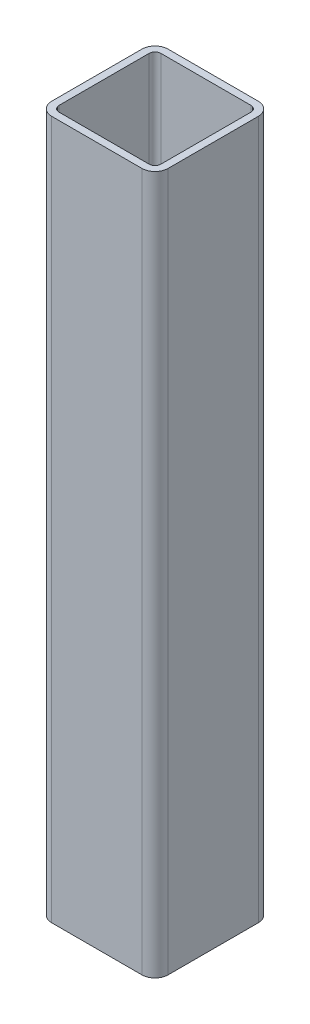
ISO-10303-21;
HEADER;
FILE_DESCRIPTION(('STEP AP214'),'2;1');
FILE_NAME('part.step','',(''),(''),'','','');
FILE_SCHEMA(('AUTOMOTIVE_DESIGN { 1 0 10303 214 1 1 1 1 }'));
ENDSEC;
DATA;
#1=APPLICATION_CONTEXT('core data for automotive mechanical design processes');
#2=APPLICATION_PROTOCOL_DEFINITION('international standard','automotive_design',2000,#1);
#3=PRODUCT_CONTEXT('',#1,'mechanical');
#4=PRODUCT('Part','Part','',(#3));
#5=PRODUCT_RELATED_PRODUCT_CATEGORY('part','',(#4));
#6=PRODUCT_DEFINITION_FORMATION('','',#4);
#7=PRODUCT_DEFINITION_CONTEXT('part definition',#1,'design');
#8=PRODUCT_DEFINITION('design','',#6,#7);
#9=PRODUCT_DEFINITION_SHAPE('','',#8);
#10=(LENGTH_UNIT() NAMED_UNIT(*) SI_UNIT(.MILLI.,.METRE.));
#11=(NAMED_UNIT(*) PLANE_ANGLE_UNIT() SI_UNIT($,.RADIAN.));
#12=(NAMED_UNIT(*) SI_UNIT($,.STERADIAN.) SOLID_ANGLE_UNIT());
#13=UNCERTAINTY_MEASURE_WITH_UNIT(LENGTH_MEASURE(1.E-05),#10,'distance_accuracy_value','');
#14=(GEOMETRIC_REPRESENTATION_CONTEXT(3) GLOBAL_UNCERTAINTY_ASSIGNED_CONTEXT((#13)) GLOBAL_UNIT_ASSIGNED_CONTEXT((#10,
#11,#12)) REPRESENTATION_CONTEXT('',''));
#15=CARTESIAN_POINT('',(0.,0.,0.));
#16=DIRECTION('',(0.,0.,1.));
#17=DIRECTION('',(1.,0.,0.));
#18=AXIS2_PLACEMENT_3D('',#15,#16,#17);
#19=CARTESIAN_POINT('',(-19.685,152.4,-19.685));
#20=DIRECTION('',(0.,-1.,0.));
#21=DIRECTION('',(0.,0.,-1.));
#22=AXIS2_PLACEMENT_3D('',#19,#20,#21);
#23=PLANE('',#22);
#24=CARTESIAN_POINT('',(-19.685,152.4,-19.685));
#25=DIRECTION('',(0.,1.,0.));
#26=DIRECTION('',(0.,0.,-1.));
#27=AXIS2_PLACEMENT_3D('',#24,#25,#26);
#28=CIRCLE('',#27,5.715);
#29=CARTESIAN_POINT('',(-19.685,152.4,-25.4));
#30=VERTEX_POINT('',#29);
#31=CARTESIAN_POINT('',(-25.4,152.4,-19.685));
#32=VERTEX_POINT('',#31);
#33=EDGE_CURVE('E208',#30,#32,#28,.T.);
#34=ORIENTED_EDGE('',*,*,#33,.T.);
#35=DIRECTION('',(0.,0.,1.));
#36=VECTOR('',#35,1.);
#37=CARTESIAN_POINT('',(-25.4,152.4,19.685));
#38=LINE('',#37,#36);
#39=CARTESIAN_POINT('',(-25.4,152.4,19.685));
#40=VERTEX_POINT('',#39);
#41=EDGE_CURVE('E211',#32,#40,#38,.T.);
#42=ORIENTED_EDGE('',*,*,#41,.T.);
#43=CARTESIAN_POINT('',(-19.685,152.4,19.685));
#44=DIRECTION('',(0.,1.,0.));
#45=DIRECTION('',(0.,0.,-1.));
#46=AXIS2_PLACEMENT_3D('',#43,#44,#45);
#47=CIRCLE('',#46,5.715);
#48=CARTESIAN_POINT('',(-19.685,152.4,25.4));
#49=VERTEX_POINT('',#48);
#50=EDGE_CURVE('E214',#40,#49,#47,.T.);
#51=ORIENTED_EDGE('',*,*,#50,.T.);
#52=DIRECTION('',(1.,0.,0.));
#53=VECTOR('',#52,1.);
#54=CARTESIAN_POINT('',(-19.685,152.4,25.4));
#55=LINE('',#54,#53);
#56=CARTESIAN_POINT('',(19.685,152.4,25.4));
#57=VERTEX_POINT('',#56);
#58=EDGE_CURVE('E216',#49,#57,#55,.T.);
#59=ORIENTED_EDGE('',*,*,#58,.T.);
#60=CARTESIAN_POINT('',(19.685,152.4,19.685));
#61=DIRECTION('',(0.,1.,0.));
#62=DIRECTION('',(0.,0.,1.));
#63=AXIS2_PLACEMENT_3D('',#60,#61,#62);
#64=CIRCLE('',#63,5.715);
#65=CARTESIAN_POINT('',(25.4,152.4,19.685));
#66=VERTEX_POINT('',#65);
#67=EDGE_CURVE('E218',#57,#66,#64,.T.);
#68=ORIENTED_EDGE('',*,*,#67,.T.);
#69=DIRECTION('',(0.,0.,-1.));
#70=VECTOR('',#69,1.);
#71=CARTESIAN_POINT('',(25.4,152.4,19.685));
#72=LINE('',#71,#70);
#73=CARTESIAN_POINT('',(25.4,152.4,-19.685));
#74=VERTEX_POINT('',#73);
#75=EDGE_CURVE('E220',#66,#74,#72,.T.);
#76=ORIENTED_EDGE('',*,*,#75,.T.);
#77=CARTESIAN_POINT('',(19.685,152.4,-19.685));
#78=DIRECTION('',(0.,1.,0.));
#79=DIRECTION('',(0.,0.,-1.));
#80=AXIS2_PLACEMENT_3D('',#77,#78,#79);
#81=CIRCLE('',#80,5.715);
#82=CARTESIAN_POINT('',(19.685,152.4,-25.4));
#83=VERTEX_POINT('',#82);
#84=EDGE_CURVE('E222',#74,#83,#81,.T.);
#85=ORIENTED_EDGE('',*,*,#84,.T.);
#86=DIRECTION('',(-1.,0.,0.));
#87=VECTOR('',#86,1.);
#88=CARTESIAN_POINT('',(-19.685,152.4,-25.4));
#89=LINE('',#88,#87);
#90=EDGE_CURVE('E224',#83,#30,#89,.T.);
#91=ORIENTED_EDGE('',*,*,#90,.T.);
#92=EDGE_LOOP('',(#34,#42,#51,#59,#68,#76,#85,#91));
#93=FACE_BOUND('',#92,.T.);
#94=CARTESIAN_POINT('',(-19.685,152.4,19.685));
#95=DIRECTION('',(0.,1.,0.));
#96=DIRECTION('',(0.,0.,-1.));
#97=AXIS2_PLACEMENT_3D('',#94,#95,#96);
#98=CIRCLE('',#97,2.54);
#99=CARTESIAN_POINT('',(-22.225,152.4,19.685));
#100=VERTEX_POINT('',#99);
#101=CARTESIAN_POINT('',(-19.685,152.4,22.225));
#102=VERTEX_POINT('',#101);
#103=EDGE_CURVE('E143',#100,#102,#98,.T.);
#104=ORIENTED_EDGE('',*,*,#103,.F.);
#105=DIRECTION('',(0.,0.,1.));
#106=VECTOR('',#105,1.);
#107=CARTESIAN_POINT('',(-22.225,152.4,19.685));
#108=LINE('',#107,#106);
#109=CARTESIAN_POINT('',(-22.225,152.4,-19.685));
#110=VERTEX_POINT('',#109);
#111=EDGE_CURVE('E176',#110,#100,#108,.T.);
#112=ORIENTED_EDGE('',*,*,#111,.F.);
#113=CARTESIAN_POINT('',(-19.685,152.4,-19.685));
#114=DIRECTION('',(0.,1.,0.));
#115=DIRECTION('',(0.,0.,-1.));
#116=AXIS2_PLACEMENT_3D('',#113,#114,#115);
#117=CIRCLE('',#116,2.54);
#118=CARTESIAN_POINT('',(-19.685,152.4,-22.225));
#119=VERTEX_POINT('',#118);
#120=EDGE_CURVE('E174',#119,#110,#117,.T.);
#121=ORIENTED_EDGE('',*,*,#120,.F.);
#122=DIRECTION('',(-1.,0.,0.));
#123=VECTOR('',#122,1.);
#124=CARTESIAN_POINT('',(-19.685,152.4,-22.225));
#125=LINE('',#124,#123);
#126=CARTESIAN_POINT('',(19.685,152.4,-22.225));
#127=VERTEX_POINT('',#126);
#128=EDGE_CURVE('E172',#127,#119,#125,.T.);
#129=ORIENTED_EDGE('',*,*,#128,.F.);
#130=CARTESIAN_POINT('',(19.685,152.4,-19.685));
#131=DIRECTION('',(0.,1.,0.));
#132=DIRECTION('',(0.,0.,-1.));
#133=AXIS2_PLACEMENT_3D('',#130,#131,#132);
#134=CIRCLE('',#133,2.54);
#135=CARTESIAN_POINT('',(22.225,152.4,-19.685));
#136=VERTEX_POINT('',#135);
#137=EDGE_CURVE('E170',#136,#127,#134,.T.);
#138=ORIENTED_EDGE('',*,*,#137,.F.);
#139=DIRECTION('',(0.,0.,-1.));
#140=VECTOR('',#139,1.);
#141=CARTESIAN_POINT('',(22.225,152.4,19.685));
#142=LINE('',#141,#140);
#143=CARTESIAN_POINT('',(22.225,152.4,19.685));
#144=VERTEX_POINT('',#143);
#145=EDGE_CURVE('E166',#144,#136,#142,.T.);
#146=ORIENTED_EDGE('',*,*,#145,.F.);
#147=CARTESIAN_POINT('',(19.685,152.4,19.685));
#148=DIRECTION('',(0.,1.,0.));
#149=DIRECTION('',(0.,0.,1.));
#150=AXIS2_PLACEMENT_3D('',#147,#148,#149);
#151=CIRCLE('',#150,2.54);
#152=CARTESIAN_POINT('',(19.685,152.4,22.225));
#153=VERTEX_POINT('',#152);
#154=EDGE_CURVE('E164',#153,#144,#151,.T.);
#155=ORIENTED_EDGE('',*,*,#154,.F.);
#156=DIRECTION('',(1.,0.,0.));
#157=VECTOR('',#156,1.);
#158=CARTESIAN_POINT('',(-19.685,152.4,22.225));
#159=LINE('',#158,#157);
#160=EDGE_CURVE('E151',#102,#153,#159,.T.);
#161=ORIENTED_EDGE('',*,*,#160,.F.);
#162=EDGE_LOOP('',(#104,#112,#121,#129,#138,#146,#155,#161));
#163=FACE_BOUND('',#162,.T.);
#164=ADVANCED_FACE('F30',(#93,#163),#23,.F.);
#165=CARTESIAN_POINT('',(-19.685,-152.4,-19.685));
#166=DIRECTION('',(0.,-1.,0.));
#167=DIRECTION('',(0.,0.,-1.));
#168=AXIS2_PLACEMENT_3D('',#165,#166,#167);
#169=PLANE('',#168);
#170=CARTESIAN_POINT('',(-19.685,-152.4,-19.685));
#171=DIRECTION('',(0.,1.,0.));
#172=DIRECTION('',(0.,0.,-1.));
#173=AXIS2_PLACEMENT_3D('',#170,#171,#172);
#174=CIRCLE('',#173,5.715);
#175=CARTESIAN_POINT('',(-19.685,-152.4,-25.4));
#176=VERTEX_POINT('',#175);
#177=CARTESIAN_POINT('',(-25.4,-152.4,-19.685));
#178=VERTEX_POINT('',#177);
#179=EDGE_CURVE('E159',#176,#178,#174,.T.);
#180=ORIENTED_EDGE('',*,*,#179,.F.);
#181=DIRECTION('',(-1.,0.,0.));
#182=VECTOR('',#181,1.);
#183=CARTESIAN_POINT('',(-19.685,-152.4,-25.4));
#184=LINE('',#183,#182);
#185=CARTESIAN_POINT('',(19.685,-152.4,-25.4));
#186=VERTEX_POINT('',#185);
#187=EDGE_CURVE('E212',#186,#176,#184,.T.);
#188=ORIENTED_EDGE('',*,*,#187,.F.);
#189=CARTESIAN_POINT('',(19.685,-152.4,-19.685));
#190=DIRECTION('',(0.,1.,0.));
#191=DIRECTION('',(0.,0.,-1.));
#192=AXIS2_PLACEMENT_3D('',#189,#190,#191);
#193=CIRCLE('',#192,5.715);
#194=CARTESIAN_POINT('',(25.4,-152.4,-19.685));
#195=VERTEX_POINT('',#194);
#196=EDGE_CURVE('E239',#195,#186,#193,.T.);
#197=ORIENTED_EDGE('',*,*,#196,.F.);
#198=DIRECTION('',(0.,0.,-1.));
#199=VECTOR('',#198,1.);
#200=CARTESIAN_POINT('',(25.4,-152.4,19.685));
#201=LINE('',#200,#199);
#202=CARTESIAN_POINT('',(25.4,-152.4,19.685));
#203=VERTEX_POINT('',#202);
#204=EDGE_CURVE('E237',#203,#195,#201,.T.);
#205=ORIENTED_EDGE('',*,*,#204,.F.);
#206=CARTESIAN_POINT('',(19.685,-152.4,19.685));
#207=DIRECTION('',(0.,1.,0.));
#208=DIRECTION('',(0.,0.,1.));
#209=AXIS2_PLACEMENT_3D('',#206,#207,#208);
#210=CIRCLE('',#209,5.715);
#211=CARTESIAN_POINT('',(19.685,-152.4,25.4));
#212=VERTEX_POINT('',#211);
#213=EDGE_CURVE('E235',#212,#203,#210,.T.);
#214=ORIENTED_EDGE('',*,*,#213,.F.);
#215=DIRECTION('',(1.,0.,0.));
#216=VECTOR('',#215,1.);
#217=CARTESIAN_POINT('',(-19.685,-152.4,25.4));
#218=LINE('',#217,#216);
#219=CARTESIAN_POINT('',(-19.685,-152.4,25.4));
#220=VERTEX_POINT('',#219);
#221=EDGE_CURVE('E233',#220,#212,#218,.T.);
#222=ORIENTED_EDGE('',*,*,#221,.F.);
#223=CARTESIAN_POINT('',(-19.685,-152.4,19.685));
#224=DIRECTION('',(0.,1.,0.));
#225=DIRECTION('',(0.,0.,-1.));
#226=AXIS2_PLACEMENT_3D('',#223,#224,#225);
#227=CIRCLE('',#226,5.715);
#228=CARTESIAN_POINT('',(-25.4,-152.4,19.685));
#229=VERTEX_POINT('',#228);
#230=EDGE_CURVE('E231',#229,#220,#227,.T.);
#231=ORIENTED_EDGE('',*,*,#230,.F.);
#232=DIRECTION('',(0.,0.,1.));
#233=VECTOR('',#232,1.);
#234=CARTESIAN_POINT('',(-25.4,-152.4,19.685));
#235=LINE('',#234,#233);
#236=EDGE_CURVE('E229',#178,#229,#235,.T.);
#237=ORIENTED_EDGE('',*,*,#236,.F.);
#238=EDGE_LOOP('',(#180,#188,#197,#205,#214,#222,#231,#237));
#239=FACE_BOUND('',#238,.T.);
#240=DIRECTION('',(0.,0.,1.));
#241=VECTOR('',#240,1.);
#242=CARTESIAN_POINT('',(-22.225,-152.4,19.685));
#243=LINE('',#242,#241);
#244=CARTESIAN_POINT('',(-22.225,-152.4,-19.685));
#245=VERTEX_POINT('',#244);
#246=CARTESIAN_POINT('',(-22.225,-152.4,19.685));
#247=VERTEX_POINT('',#246);
#248=EDGE_CURVE('E152',#245,#247,#243,.T.);
#249=ORIENTED_EDGE('',*,*,#248,.T.);
#250=CARTESIAN_POINT('',(-19.685,-152.4,19.685));
#251=DIRECTION('',(0.,1.,0.));
#252=DIRECTION('',(0.,0.,-1.));
#253=AXIS2_PLACEMENT_3D('',#250,#251,#252);
#254=CIRCLE('',#253,2.54);
#255=CARTESIAN_POINT('',(-19.685,-152.4,22.225));
#256=VERTEX_POINT('',#255);
#257=EDGE_CURVE('E53',#247,#256,#254,.T.);
#258=ORIENTED_EDGE('',*,*,#257,.T.);
#259=DIRECTION('',(1.,0.,0.));
#260=VECTOR('',#259,1.);
#261=CARTESIAN_POINT('',(-19.685,-152.4,22.225));
#262=LINE('',#261,#260);
#263=CARTESIAN_POINT('',(19.685,-152.4,22.225));
#264=VERTEX_POINT('',#263);
#265=EDGE_CURVE('E158',#256,#264,#262,.T.);
#266=ORIENTED_EDGE('',*,*,#265,.T.);
#267=CARTESIAN_POINT('',(19.685,-152.4,19.685));
#268=DIRECTION('',(0.,1.,0.));
#269=DIRECTION('',(0.,0.,1.));
#270=AXIS2_PLACEMENT_3D('',#267,#268,#269);
#271=CIRCLE('',#270,2.54);
#272=CARTESIAN_POINT('',(22.225,-152.4,19.685));
#273=VERTEX_POINT('',#272);
#274=EDGE_CURVE('E180',#264,#273,#271,.T.);
#275=ORIENTED_EDGE('',*,*,#274,.T.);
#276=DIRECTION('',(0.,0.,-1.));
#277=VECTOR('',#276,1.);
#278=CARTESIAN_POINT('',(22.225,-152.4,19.685));
#279=LINE('',#278,#277);
#280=CARTESIAN_POINT('',(22.225,-152.4,-19.685));
#281=VERTEX_POINT('',#280);
#282=EDGE_CURVE('E183',#273,#281,#279,.T.);
#283=ORIENTED_EDGE('',*,*,#282,.T.);
#284=CARTESIAN_POINT('',(19.685,-152.4,-19.685));
#285=DIRECTION('',(0.,1.,0.));
#286=DIRECTION('',(0.,0.,-1.));
#287=AXIS2_PLACEMENT_3D('',#284,#285,#286);
#288=CIRCLE('',#287,2.54);
#289=CARTESIAN_POINT('',(19.685,-152.4,-22.225));
#290=VERTEX_POINT('',#289);
#291=EDGE_CURVE('E186',#281,#290,#288,.T.);
#292=ORIENTED_EDGE('',*,*,#291,.T.);
#293=DIRECTION('',(-1.,0.,0.));
#294=VECTOR('',#293,1.);
#295=CARTESIAN_POINT('',(-19.685,-152.4,-22.225));
#296=LINE('',#295,#294);
#297=CARTESIAN_POINT('',(-19.685,-152.4,-22.225));
#298=VERTEX_POINT('',#297);
#299=EDGE_CURVE('E189',#290,#298,#296,.T.);
#300=ORIENTED_EDGE('',*,*,#299,.T.);
#301=CARTESIAN_POINT('',(-19.685,-152.4,-19.685));
#302=DIRECTION('',(0.,1.,0.));
#303=DIRECTION('',(0.,0.,-1.));
#304=AXIS2_PLACEMENT_3D('',#301,#302,#303);
#305=CIRCLE('',#304,2.54);
#306=EDGE_CURVE('E192',#298,#245,#305,.T.);
#307=ORIENTED_EDGE('',*,*,#306,.T.);
#308=EDGE_LOOP('',(#249,#258,#266,#275,#283,#292,#300,#307));
#309=FACE_BOUND('',#308,.T.);
#310=ADVANCED_FACE('F269',(#239,#309),#169,.T.);
#311=CARTESIAN_POINT('',(-19.685,152.4,-19.685));
#312=DIRECTION('',(0.,-1.,0.));
#313=DIRECTION('',(0.,0.,-1.));
#314=AXIS2_PLACEMENT_3D('',#311,#312,#313);
#315=CYLINDRICAL_SURFACE('',#314,5.715);
#316=ORIENTED_EDGE('',*,*,#179,.T.);
#317=DIRECTION('',(0.,-1.,0.));
#318=VECTOR('',#317,1.);
#319=CARTESIAN_POINT('',(-25.4,152.4,-19.685));
#320=LINE('',#319,#318);
#321=EDGE_CURVE('E11',#32,#178,#320,.T.);
#322=ORIENTED_EDGE('',*,*,#321,.F.);
#323=ORIENTED_EDGE('',*,*,#33,.F.);
#324=DIRECTION('',(0.,-1.,0.));
#325=VECTOR('',#324,1.);
#326=CARTESIAN_POINT('',(-19.685,152.4,-25.4));
#327=LINE('',#326,#325);
#328=EDGE_CURVE('E226',#30,#176,#327,.T.);
#329=ORIENTED_EDGE('',*,*,#328,.T.);
#330=EDGE_LOOP('',(#316,#322,#323,#329));
#331=FACE_BOUND('',#330,.T.);
#332=ADVANCED_FACE('F32',(#331),#315,.T.);
#333=CARTESIAN_POINT('',(-25.4,152.4,19.685));
#334=DIRECTION('',(1.,0.,0.));
#335=DIRECTION('',(0.,0.,-1.));
#336=AXIS2_PLACEMENT_3D('',#333,#334,#335);
#337=PLANE('',#336);
#338=ORIENTED_EDGE('',*,*,#236,.T.);
#339=DIRECTION('',(0.,-1.,0.));
#340=VECTOR('',#339,1.);
#341=CARTESIAN_POINT('',(-25.4,152.4,19.685));
#342=LINE('',#341,#340);
#343=EDGE_CURVE('E38',#40,#229,#342,.T.);
#344=ORIENTED_EDGE('',*,*,#343,.F.);
#345=ORIENTED_EDGE('',*,*,#41,.F.);
#346=ORIENTED_EDGE('',*,*,#321,.T.);
#347=EDGE_LOOP('',(#338,#344,#345,#346));
#348=FACE_BOUND('',#347,.T.);
#349=ADVANCED_FACE('F286',(#348),#337,.F.);
#350=CARTESIAN_POINT('',(-19.685,152.4,19.685));
#351=DIRECTION('',(0.,-1.,0.));
#352=DIRECTION('',(0.,0.,-1.));
#353=AXIS2_PLACEMENT_3D('',#350,#351,#352);
#354=CYLINDRICAL_SURFACE('',#353,5.715);
#355=ORIENTED_EDGE('',*,*,#230,.T.);
#356=DIRECTION('',(0.,-1.,0.));
#357=VECTOR('',#356,1.);
#358=CARTESIAN_POINT('',(-19.685,152.4,25.4));
#359=LINE('',#358,#357);
#360=EDGE_CURVE('E256',#49,#220,#359,.T.);
#361=ORIENTED_EDGE('',*,*,#360,.F.);
#362=ORIENTED_EDGE('',*,*,#50,.F.);
#363=ORIENTED_EDGE('',*,*,#343,.T.);
#364=EDGE_LOOP('',(#355,#361,#362,#363));
#365=FACE_BOUND('',#364,.T.);
#366=ADVANCED_FACE('F263',(#365),#354,.T.);
#367=CARTESIAN_POINT('',(-19.685,152.4,25.4));
#368=DIRECTION('',(0.,0.,-1.));
#369=DIRECTION('',(-1.,0.,0.));
#370=AXIS2_PLACEMENT_3D('',#367,#368,#369);
#371=PLANE('',#370);
#372=ORIENTED_EDGE('',*,*,#221,.T.);
#373=DIRECTION('',(0.,-1.,0.));
#374=VECTOR('',#373,1.);
#375=CARTESIAN_POINT('',(19.685,152.4,25.4));
#376=LINE('',#375,#374);
#377=EDGE_CURVE('E253',#57,#212,#376,.T.);
#378=ORIENTED_EDGE('',*,*,#377,.F.);
#379=ORIENTED_EDGE('',*,*,#58,.F.);
#380=ORIENTED_EDGE('',*,*,#360,.T.);
#381=EDGE_LOOP('',(#372,#378,#379,#380));
#382=FACE_BOUND('',#381,.T.);
#383=ADVANCED_FACE('F275',(#382),#371,.F.);
#384=CARTESIAN_POINT('',(19.685,152.4,19.685));
#385=DIRECTION('',(0.,-1.,0.));
#386=DIRECTION('',(0.,0.,-1.));
#387=AXIS2_PLACEMENT_3D('',#384,#385,#386);
#388=CYLINDRICAL_SURFACE('',#387,5.715);
#389=ORIENTED_EDGE('',*,*,#213,.T.);
#390=DIRECTION('',(0.,-1.,0.));
#391=VECTOR('',#390,1.);
#392=CARTESIAN_POINT('',(25.4,152.4,19.685));
#393=LINE('',#392,#391);
#394=EDGE_CURVE('E250',#66,#203,#393,.T.);
#395=ORIENTED_EDGE('',*,*,#394,.F.);
#396=ORIENTED_EDGE('',*,*,#67,.F.);
#397=ORIENTED_EDGE('',*,*,#377,.T.);
#398=EDGE_LOOP('',(#389,#395,#396,#397));
#399=FACE_BOUND('',#398,.T.);
#400=ADVANCED_FACE('F279',(#399),#388,.T.);
#401=CARTESIAN_POINT('',(25.4,152.4,19.685));
#402=DIRECTION('',(-1.,0.,0.));
#403=DIRECTION('',(0.,0.,1.));
#404=AXIS2_PLACEMENT_3D('',#401,#402,#403);
#405=PLANE('',#404);
#406=ORIENTED_EDGE('',*,*,#204,.T.);
#407=DIRECTION('',(0.,-1.,0.));
#408=VECTOR('',#407,1.);
#409=CARTESIAN_POINT('',(25.4,152.4,-19.685));
#410=LINE('',#409,#408);
#411=EDGE_CURVE('E247',#74,#195,#410,.T.);
#412=ORIENTED_EDGE('',*,*,#411,.F.);
#413=ORIENTED_EDGE('',*,*,#75,.F.);
#414=ORIENTED_EDGE('',*,*,#394,.T.);
#415=EDGE_LOOP('',(#406,#412,#413,#414));
#416=FACE_BOUND('',#415,.T.);
#417=ADVANCED_FACE('F299',(#416),#405,.F.);
#418=CARTESIAN_POINT('',(19.685,152.4,-19.685));
#419=DIRECTION('',(0.,-1.,0.));
#420=DIRECTION('',(0.,0.,-1.));
#421=AXIS2_PLACEMENT_3D('',#418,#419,#420);
#422=CYLINDRICAL_SURFACE('',#421,5.715);
#423=ORIENTED_EDGE('',*,*,#196,.T.);
#424=DIRECTION('',(0.,-1.,0.));
#425=VECTOR('',#424,1.);
#426=CARTESIAN_POINT('',(19.685,152.4,-25.4));
#427=LINE('',#426,#425);
#428=EDGE_CURVE('E244',#83,#186,#427,.T.);
#429=ORIENTED_EDGE('',*,*,#428,.F.);
#430=ORIENTED_EDGE('',*,*,#84,.F.);
#431=ORIENTED_EDGE('',*,*,#411,.T.);
#432=EDGE_LOOP('',(#423,#429,#430,#431));
#433=FACE_BOUND('',#432,.T.);
#434=ADVANCED_FACE('F297',(#433),#422,.T.);
#435=CARTESIAN_POINT('',(-19.685,152.4,-25.4));
#436=DIRECTION('',(0.,0.,1.));
#437=DIRECTION('',(1.,0.,0.));
#438=AXIS2_PLACEMENT_3D('',#435,#436,#437);
#439=PLANE('',#438);
#440=ORIENTED_EDGE('',*,*,#187,.T.);
#441=ORIENTED_EDGE('',*,*,#328,.F.);
#442=ORIENTED_EDGE('',*,*,#90,.F.);
#443=ORIENTED_EDGE('',*,*,#428,.T.);
#444=EDGE_LOOP('',(#440,#441,#442,#443));
#445=FACE_BOUND('',#444,.T.);
#446=ADVANCED_FACE('F292',(#445),#439,.F.);
#447=CARTESIAN_POINT('',(-19.685,152.4,19.685));
#448=DIRECTION('',(0.,-1.,0.));
#449=DIRECTION('',(0.,0.,-1.));
#450=AXIS2_PLACEMENT_3D('',#447,#448,#449);
#451=CYLINDRICAL_SURFACE('',#450,2.54);
#452=ORIENTED_EDGE('',*,*,#257,.F.);
#453=DIRECTION('',(0.,-1.,0.));
#454=VECTOR('',#453,1.);
#455=CARTESIAN_POINT('',(-22.225,152.4,19.685));
#456=LINE('',#455,#454);
#457=EDGE_CURVE('E147',#100,#247,#456,.T.);
#458=ORIENTED_EDGE('',*,*,#457,.F.);
#459=ORIENTED_EDGE('',*,*,#103,.T.);
#460=DIRECTION('',(0.,-1.,0.));
#461=VECTOR('',#460,1.);
#462=CARTESIAN_POINT('',(-19.685,152.4,22.225));
#463=LINE('',#462,#461);
#464=EDGE_CURVE('E146',#102,#256,#463,.T.);
#465=ORIENTED_EDGE('',*,*,#464,.T.);
#466=EDGE_LOOP('',(#452,#458,#459,#465));
#467=FACE_BOUND('',#466,.T.);
#468=ADVANCED_FACE('F145',(#467),#451,.F.);
#469=CARTESIAN_POINT('',(-19.685,152.4,22.225));
#470=DIRECTION('',(0.,0.,-1.));
#471=DIRECTION('',(-1.,0.,0.));
#472=AXIS2_PLACEMENT_3D('',#469,#470,#471);
#473=PLANE('',#472);
#474=ORIENTED_EDGE('',*,*,#265,.F.);
#475=ORIENTED_EDGE('',*,*,#464,.F.);
#476=ORIENTED_EDGE('',*,*,#160,.T.);
#477=DIRECTION('',(0.,-1.,0.));
#478=VECTOR('',#477,1.);
#479=CARTESIAN_POINT('',(19.685,152.4,22.225));
#480=LINE('',#479,#478);
#481=EDGE_CURVE('E160',#153,#264,#480,.T.);
#482=ORIENTED_EDGE('',*,*,#481,.T.);
#483=EDGE_LOOP('',(#474,#475,#476,#482));
#484=FACE_BOUND('',#483,.T.);
#485=ADVANCED_FACE('F155',(#484),#473,.T.);
#486=CARTESIAN_POINT('',(19.685,152.4,19.685));
#487=DIRECTION('',(0.,-1.,0.));
#488=DIRECTION('',(0.,0.,-1.));
#489=AXIS2_PLACEMENT_3D('',#486,#487,#488);
#490=CYLINDRICAL_SURFACE('',#489,2.54);
#491=ORIENTED_EDGE('',*,*,#274,.F.);
#492=ORIENTED_EDGE('',*,*,#481,.F.);
#493=ORIENTED_EDGE('',*,*,#154,.T.);
#494=DIRECTION('',(0.,-1.,0.));
#495=VECTOR('',#494,1.);
#496=CARTESIAN_POINT('',(22.225,152.4,19.685));
#497=LINE('',#496,#495);
#498=EDGE_CURVE('E205',#144,#273,#497,.T.);
#499=ORIENTED_EDGE('',*,*,#498,.T.);
#500=EDGE_LOOP('',(#491,#492,#493,#499));
#501=FACE_BOUND('',#500,.T.);
#502=ADVANCED_FACE('F324',(#501),#490,.F.);
#503=CARTESIAN_POINT('',(22.225,152.4,19.685));
#504=DIRECTION('',(-1.,0.,0.));
#505=DIRECTION('',(0.,0.,1.));
#506=AXIS2_PLACEMENT_3D('',#503,#504,#505);
#507=PLANE('',#506);
#508=ORIENTED_EDGE('',*,*,#282,.F.);
#509=ORIENTED_EDGE('',*,*,#498,.F.);
#510=ORIENTED_EDGE('',*,*,#145,.T.);
#511=DIRECTION('',(0.,-1.,0.));
#512=VECTOR('',#511,1.);
#513=CARTESIAN_POINT('',(22.225,152.4,-19.685));
#514=LINE('',#513,#512);
#515=EDGE_CURVE('E203',#136,#281,#514,.T.);
#516=ORIENTED_EDGE('',*,*,#515,.T.);
#517=EDGE_LOOP('',(#508,#509,#510,#516));
#518=FACE_BOUND('',#517,.T.);
#519=ADVANCED_FACE('F328',(#518),#507,.T.);
#520=CARTESIAN_POINT('',(19.685,152.4,-19.685));
#521=DIRECTION('',(0.,-1.,0.));
#522=DIRECTION('',(0.,0.,-1.));
#523=AXIS2_PLACEMENT_3D('',#520,#521,#522);
#524=CYLINDRICAL_SURFACE('',#523,2.54);
#525=ORIENTED_EDGE('',*,*,#291,.F.);
#526=ORIENTED_EDGE('',*,*,#515,.F.);
#527=ORIENTED_EDGE('',*,*,#137,.T.);
#528=DIRECTION('',(0.,-1.,0.));
#529=VECTOR('',#528,1.);
#530=CARTESIAN_POINT('',(19.685,152.4,-22.225));
#531=LINE('',#530,#529);
#532=EDGE_CURVE('E201',#127,#290,#531,.T.);
#533=ORIENTED_EDGE('',*,*,#532,.T.);
#534=EDGE_LOOP('',(#525,#526,#527,#533));
#535=FACE_BOUND('',#534,.T.);
#536=ADVANCED_FACE('F334',(#535),#524,.F.);
#537=CARTESIAN_POINT('',(-19.685,152.4,-22.225));
#538=DIRECTION('',(0.,0.,1.));
#539=DIRECTION('',(1.,0.,0.));
#540=AXIS2_PLACEMENT_3D('',#537,#538,#539);
#541=PLANE('',#540);
#542=ORIENTED_EDGE('',*,*,#299,.F.);
#543=ORIENTED_EDGE('',*,*,#532,.F.);
#544=ORIENTED_EDGE('',*,*,#128,.T.);
#545=DIRECTION('',(0.,-1.,0.));
#546=VECTOR('',#545,1.);
#547=CARTESIAN_POINT('',(-19.685,152.4,-22.225));
#548=LINE('',#547,#546);
#549=EDGE_CURVE('E199',#119,#298,#548,.T.);
#550=ORIENTED_EDGE('',*,*,#549,.T.);
#551=EDGE_LOOP('',(#542,#543,#544,#550));
#552=FACE_BOUND('',#551,.T.);
#553=ADVANCED_FACE('F338',(#552),#541,.T.);
#554=CARTESIAN_POINT('',(-19.685,152.4,-19.685));
#555=DIRECTION('',(0.,-1.,0.));
#556=DIRECTION('',(0.,0.,-1.));
#557=AXIS2_PLACEMENT_3D('',#554,#555,#556);
#558=CYLINDRICAL_SURFACE('',#557,2.54);
#559=ORIENTED_EDGE('',*,*,#306,.F.);
#560=ORIENTED_EDGE('',*,*,#549,.F.);
#561=ORIENTED_EDGE('',*,*,#120,.T.);
#562=DIRECTION('',(0.,-1.,0.));
#563=VECTOR('',#562,1.);
#564=CARTESIAN_POINT('',(-22.225,152.4,-19.685));
#565=LINE('',#564,#563);
#566=EDGE_CURVE('E45',#110,#245,#565,.T.);
#567=ORIENTED_EDGE('',*,*,#566,.T.);
#568=EDGE_LOOP('',(#559,#560,#561,#567));
#569=FACE_BOUND('',#568,.T.);
#570=ADVANCED_FACE('F342',(#569),#558,.F.);
#571=CARTESIAN_POINT('',(-22.225,152.4,19.685));
#572=DIRECTION('',(1.,0.,0.));
#573=DIRECTION('',(0.,0.,-1.));
#574=AXIS2_PLACEMENT_3D('',#571,#572,#573);
#575=PLANE('',#574);
#576=ORIENTED_EDGE('',*,*,#248,.F.);
#577=ORIENTED_EDGE('',*,*,#566,.F.);
#578=ORIENTED_EDGE('',*,*,#111,.T.);
#579=ORIENTED_EDGE('',*,*,#457,.T.);
#580=EDGE_LOOP('',(#576,#577,#578,#579));
#581=FACE_BOUND('',#580,.T.);
#582=ADVANCED_FACE('F346',(#581),#575,.T.);
#583=CLOSED_SHELL('',(#164,#310,#332,#349,#366,#383,#400,#417,#434,#446,#468,#485,#502,#519,
#536,#553,#570,#582));
#584=MANIFOLD_SOLID_BREP('B2',#583);
#585=ADVANCED_BREP_SHAPE_REPRESENTATION('',(#18,#584),#14);
#586=SHAPE_DEFINITION_REPRESENTATION(#9,#585);
ENDSEC;
END-ISO-10303-21;
